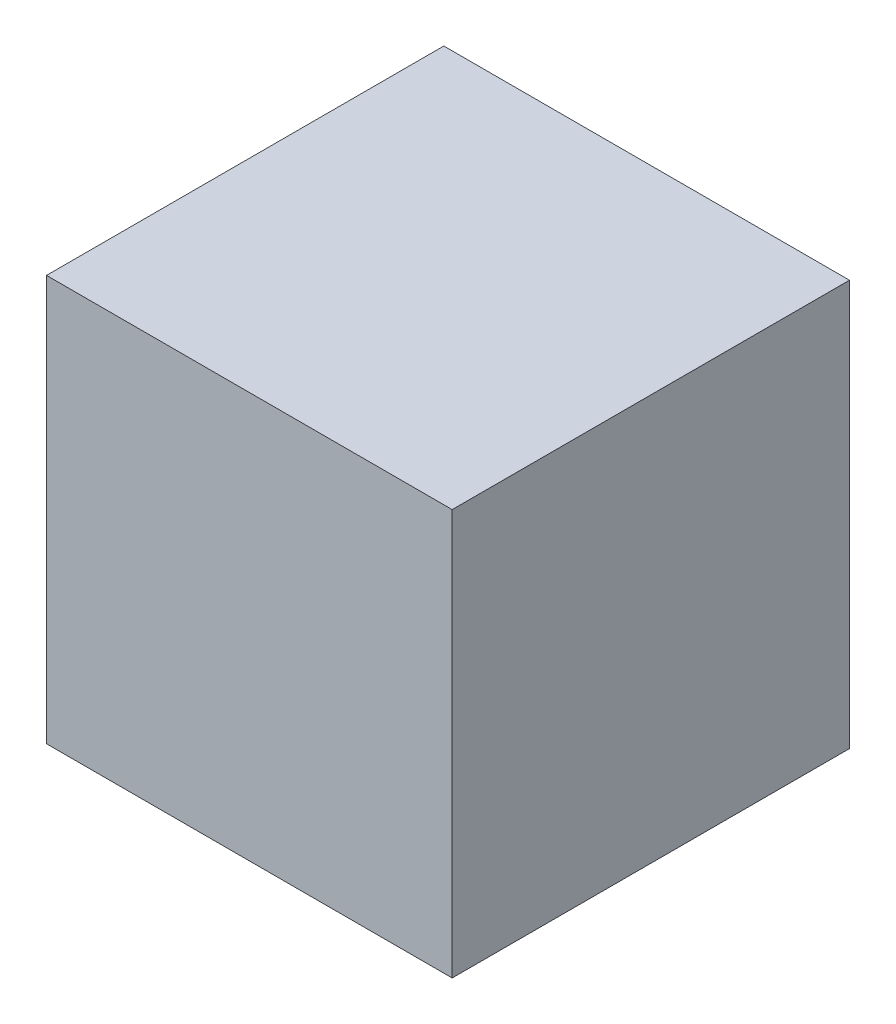
ISO-10303-21;
HEADER;
FILE_DESCRIPTION(('STEP AP214'),'2;1');
FILE_NAME('part.step','',(''),(''),'','','');
FILE_SCHEMA(('AUTOMOTIVE_DESIGN { 1 0 10303 214 1 1 1 1 }'));
ENDSEC;
DATA;
#1=APPLICATION_CONTEXT('core data for automotive mechanical design processes');
#2=APPLICATION_PROTOCOL_DEFINITION('international standard','automotive_design',2000,#1);
#3=PRODUCT_CONTEXT('',#1,'mechanical');
#4=PRODUCT('Part','Part','',(#3));
#5=PRODUCT_RELATED_PRODUCT_CATEGORY('part','',(#4));
#6=PRODUCT_DEFINITION_FORMATION('','',#4);
#7=PRODUCT_DEFINITION_CONTEXT('part definition',#1,'design');
#8=PRODUCT_DEFINITION('design','',#6,#7);
#9=PRODUCT_DEFINITION_SHAPE('','',#8);
#10=(LENGTH_UNIT() NAMED_UNIT(*) SI_UNIT(.MILLI.,.METRE.));
#11=(NAMED_UNIT(*) PLANE_ANGLE_UNIT() SI_UNIT($,.RADIAN.));
#12=(NAMED_UNIT(*) SI_UNIT($,.STERADIAN.) SOLID_ANGLE_UNIT());
#13=UNCERTAINTY_MEASURE_WITH_UNIT(LENGTH_MEASURE(1.E-05),#10,'distance_accuracy_value','');
#14=(GEOMETRIC_REPRESENTATION_CONTEXT(3) GLOBAL_UNCERTAINTY_ASSIGNED_CONTEXT((#13)) GLOBAL_UNIT_ASSIGNED_CONTEXT((#10,
#11,#12)) REPRESENTATION_CONTEXT('',''));
#15=CARTESIAN_POINT('',(0.,0.,0.));
#16=DIRECTION('',(0.,0.,1.));
#17=DIRECTION('',(1.,0.,0.));
#18=AXIS2_PLACEMENT_3D('',#15,#16,#17);
#19=CARTESIAN_POINT('',(-48.5,48.5,47.5));
#20=DIRECTION('',(1.,0.,0.));
#21=DIRECTION('',(0.,0.,-1.));
#22=AXIS2_PLACEMENT_3D('',#19,#20,#21);
#23=PLANE('',#22);
#24=DIRECTION('',(0.,0.,1.));
#25=VECTOR('',#24,1.);
#26=CARTESIAN_POINT('',(-48.5,-48.5,47.5));
#27=LINE('',#26,#25);
#28=CARTESIAN_POINT('',(-48.5,-48.5,-47.5));
#29=VERTEX_POINT('',#28);
#30=CARTESIAN_POINT('',(-48.5,-48.5,47.5));
#31=VERTEX_POINT('',#30);
#32=EDGE_CURVE('E95',#29,#31,#27,.T.);
#33=ORIENTED_EDGE('',*,*,#32,.T.);
#34=DIRECTION('',(0.,-1.,0.));
#35=VECTOR('',#34,1.);
#36=CARTESIAN_POINT('',(-48.5,48.5,47.5));
#37=LINE('',#36,#35);
#38=CARTESIAN_POINT('',(-48.5,48.5,47.5));
#39=VERTEX_POINT('',#38);
#40=EDGE_CURVE('E11',#39,#31,#37,.T.);
#41=ORIENTED_EDGE('',*,*,#40,.F.);
#42=DIRECTION('',(0.,0.,1.));
#43=VECTOR('',#42,1.);
#44=CARTESIAN_POINT('',(-48.5,48.5,47.5));
#45=LINE('',#44,#43);
#46=CARTESIAN_POINT('',(-48.5,48.5,-47.5));
#47=VERTEX_POINT('',#46);
#48=EDGE_CURVE('E83',#47,#39,#45,.T.);
#49=ORIENTED_EDGE('',*,*,#48,.F.);
#50=DIRECTION('',(0.,-1.,0.));
#51=VECTOR('',#50,1.);
#52=CARTESIAN_POINT('',(-48.5,48.5,-47.5));
#53=LINE('',#52,#51);
#54=EDGE_CURVE('E91',#47,#29,#53,.T.);
#55=ORIENTED_EDGE('',*,*,#54,.T.);
#56=EDGE_LOOP('',(#33,#41,#49,#55));
#57=FACE_BOUND('',#56,.T.);
#58=ADVANCED_FACE('F32',(#57),#23,.F.);
#59=CARTESIAN_POINT('',(48.5,48.5,47.5));
#60=DIRECTION('',(0.,0.,-1.));
#61=DIRECTION('',(-1.,0.,0.));
#62=AXIS2_PLACEMENT_3D('',#59,#60,#61);
#63=PLANE('',#62);
#64=DIRECTION('',(1.,0.,0.));
#65=VECTOR('',#64,1.);
#66=CARTESIAN_POINT('',(48.5,-48.5,47.5));
#67=LINE('',#66,#65);
#68=CARTESIAN_POINT('',(48.5,-48.5,47.5));
#69=VERTEX_POINT('',#68);
#70=EDGE_CURVE('E87',#31,#69,#67,.T.);
#71=ORIENTED_EDGE('',*,*,#70,.T.);
#72=DIRECTION('',(0.,-1.,0.));
#73=VECTOR('',#72,1.);
#74=CARTESIAN_POINT('',(48.5,48.5,47.5));
#75=LINE('',#74,#73);
#76=CARTESIAN_POINT('',(48.5,48.5,47.5));
#77=VERTEX_POINT('',#76);
#78=EDGE_CURVE('E40',#77,#69,#75,.T.);
#79=ORIENTED_EDGE('',*,*,#78,.F.);
#80=DIRECTION('',(1.,0.,0.));
#81=VECTOR('',#80,1.);
#82=CARTESIAN_POINT('',(48.5,48.5,47.5));
#83=LINE('',#82,#81);
#84=EDGE_CURVE('E78',#39,#77,#83,.T.);
#85=ORIENTED_EDGE('',*,*,#84,.F.);
#86=ORIENTED_EDGE('',*,*,#40,.T.);
#87=EDGE_LOOP('',(#71,#79,#85,#86));
#88=FACE_BOUND('',#87,.T.);
#89=ADVANCED_FACE('F86',(#88),#63,.F.);
#90=CARTESIAN_POINT('',(48.5,48.5,47.5));
#91=DIRECTION('',(-1.,0.,0.));
#92=DIRECTION('',(0.,0.,1.));
#93=AXIS2_PLACEMENT_3D('',#90,#91,#92);
#94=PLANE('',#93);
#95=DIRECTION('',(0.,0.,-1.));
#96=VECTOR('',#95,1.);
#97=CARTESIAN_POINT('',(48.5,-48.5,47.5));
#98=LINE('',#97,#96);
#99=CARTESIAN_POINT('',(48.5,-48.5,-47.5));
#100=VERTEX_POINT('',#99);
#101=EDGE_CURVE('E65',#69,#100,#98,.T.);
#102=ORIENTED_EDGE('',*,*,#101,.T.);
#103=DIRECTION('',(0.,-1.,0.));
#104=VECTOR('',#103,1.);
#105=CARTESIAN_POINT('',(48.5,48.5,-47.5));
#106=LINE('',#105,#104);
#107=CARTESIAN_POINT('',(48.5,48.5,-47.5));
#108=VERTEX_POINT('',#107);
#109=EDGE_CURVE('E88',#108,#100,#106,.T.);
#110=ORIENTED_EDGE('',*,*,#109,.F.);
#111=DIRECTION('',(0.,0.,-1.));
#112=VECTOR('',#111,1.);
#113=CARTESIAN_POINT('',(48.5,48.5,47.5));
#114=LINE('',#113,#112);
#115=EDGE_CURVE('E81',#77,#108,#114,.T.);
#116=ORIENTED_EDGE('',*,*,#115,.F.);
#117=ORIENTED_EDGE('',*,*,#78,.T.);
#118=EDGE_LOOP('',(#102,#110,#116,#117));
#119=FACE_BOUND('',#118,.T.);
#120=ADVANCED_FACE('F89',(#119),#94,.F.);
#121=CARTESIAN_POINT('',(48.5,48.5,-47.5));
#122=DIRECTION('',(0.,0.,1.));
#123=DIRECTION('',(1.,0.,0.));
#124=AXIS2_PLACEMENT_3D('',#121,#122,#123);
#125=PLANE('',#124);
#126=DIRECTION('',(-1.,0.,0.));
#127=VECTOR('',#126,1.);
#128=CARTESIAN_POINT('',(48.5,-48.5,-47.5));
#129=LINE('',#128,#127);
#130=EDGE_CURVE('E71',#100,#29,#129,.T.);
#131=ORIENTED_EDGE('',*,*,#130,.T.);
#132=ORIENTED_EDGE('',*,*,#54,.F.);
#133=DIRECTION('',(-1.,0.,0.));
#134=VECTOR('',#133,1.);
#135=CARTESIAN_POINT('',(48.5,48.5,-47.5));
#136=LINE('',#135,#134);
#137=EDGE_CURVE('E48',#108,#47,#136,.T.);
#138=ORIENTED_EDGE('',*,*,#137,.F.);
#139=ORIENTED_EDGE('',*,*,#109,.T.);
#140=EDGE_LOOP('',(#131,#132,#138,#139));
#141=FACE_BOUND('',#140,.T.);
#142=ADVANCED_FACE('F102',(#141),#125,.F.);
#143=CARTESIAN_POINT('',(0.,48.5,0.));
#144=DIRECTION('',(0.,1.,0.));
#145=DIRECTION('',(0.,0.,1.));
#146=AXIS2_PLACEMENT_3D('',#143,#144,#145);
#147=PLANE('',#146);
#148=ORIENTED_EDGE('',*,*,#48,.T.);
#149=ORIENTED_EDGE('',*,*,#84,.T.);
#150=ORIENTED_EDGE('',*,*,#115,.T.);
#151=ORIENTED_EDGE('',*,*,#137,.T.);
#152=EDGE_LOOP('',(#148,#149,#150,#151));
#153=FACE_BOUND('',#152,.T.);
#154=ADVANCED_FACE('F79',(#153),#147,.T.);
#155=CARTESIAN_POINT('',(0.,-48.5,0.));
#156=DIRECTION('',(0.,1.,0.));
#157=DIRECTION('',(0.,0.,1.));
#158=AXIS2_PLACEMENT_3D('',#155,#156,#157);
#159=PLANE('',#158);
#160=ORIENTED_EDGE('',*,*,#32,.F.);
#161=ORIENTED_EDGE('',*,*,#130,.F.);
#162=ORIENTED_EDGE('',*,*,#101,.F.);
#163=ORIENTED_EDGE('',*,*,#70,.F.);
#164=EDGE_LOOP('',(#160,#161,#162,#163));
#165=FACE_BOUND('',#164,.T.);
#166=ADVANCED_FACE('F105',(#165),#159,.F.);
#167=CLOSED_SHELL('',(#58,#89,#120,#142,#154,#166));
#168=MANIFOLD_SOLID_BREP('B2',#167);
#169=ADVANCED_BREP_SHAPE_REPRESENTATION('',(#18,#168),#14);
#170=SHAPE_DEFINITION_REPRESENTATION(#9,#169);
ENDSEC;
END-ISO-10303-21;
